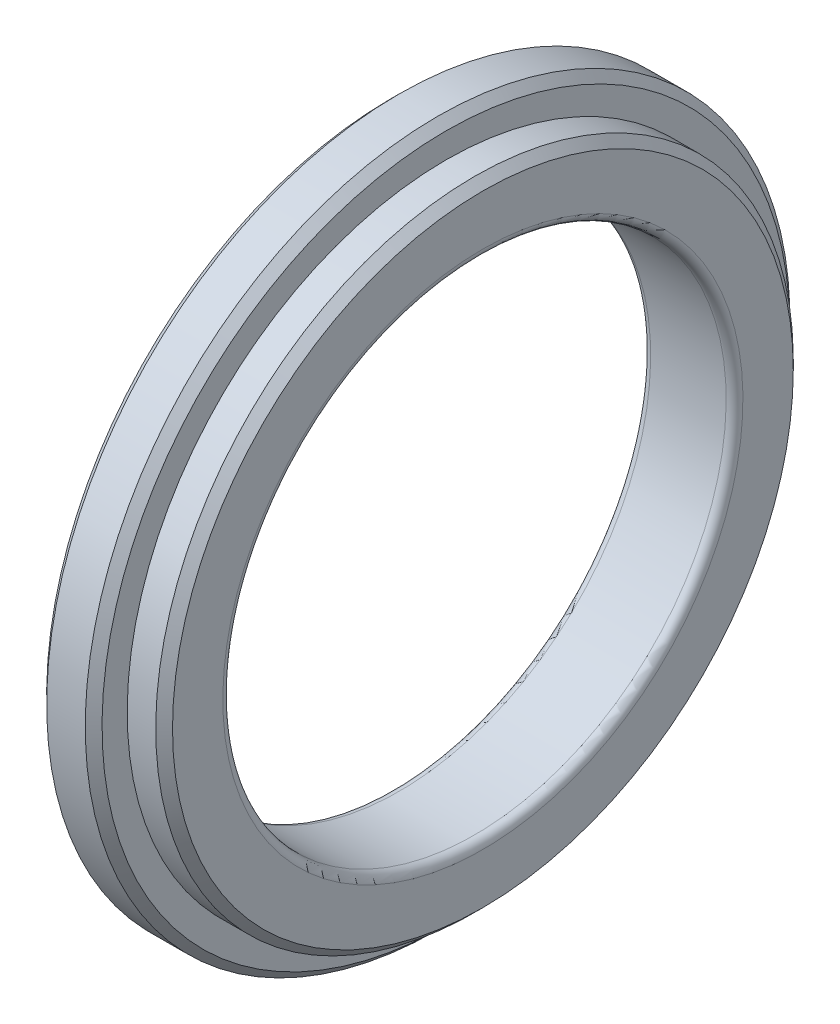
ISO-10303-21;
HEADER;
FILE_DESCRIPTION(('STEP AP214'),'2;1');
FILE_NAME('part.step','',(''),(''),'','','');
FILE_SCHEMA(('AUTOMOTIVE_DESIGN { 1 0 10303 214 1 1 1 1 }'));
ENDSEC;
DATA;
#1=APPLICATION_CONTEXT('core data for automotive mechanical design processes');
#2=APPLICATION_PROTOCOL_DEFINITION('international standard','automotive_design',2000,#1);
#3=PRODUCT_CONTEXT('',#1,'mechanical');
#4=PRODUCT('Part','Part','',(#3));
#5=PRODUCT_RELATED_PRODUCT_CATEGORY('part','',(#4));
#6=PRODUCT_DEFINITION_FORMATION('','',#4);
#7=PRODUCT_DEFINITION_CONTEXT('part definition',#1,'design');
#8=PRODUCT_DEFINITION('design','',#6,#7);
#9=PRODUCT_DEFINITION_SHAPE('','',#8);
#10=(LENGTH_UNIT() NAMED_UNIT(*) SI_UNIT(.MILLI.,.METRE.));
#11=(NAMED_UNIT(*) PLANE_ANGLE_UNIT() SI_UNIT($,.RADIAN.));
#12=(NAMED_UNIT(*) SI_UNIT($,.STERADIAN.) SOLID_ANGLE_UNIT());
#13=UNCERTAINTY_MEASURE_WITH_UNIT(LENGTH_MEASURE(1.E-05),#10,'distance_accuracy_value','');
#14=(GEOMETRIC_REPRESENTATION_CONTEXT(3) GLOBAL_UNCERTAINTY_ASSIGNED_CONTEXT((#13)) GLOBAL_UNIT_ASSIGNED_CONTEXT((#10,
#11,#12)) REPRESENTATION_CONTEXT('',''));
#15=CARTESIAN_POINT('',(0.,0.,0.));
#16=DIRECTION('',(0.,0.,1.));
#17=DIRECTION('',(1.,0.,0.));
#18=AXIS2_PLACEMENT_3D('',#15,#16,#17);
#19=CARTESIAN_POINT('',(28.25,0.,0.));
#20=DIRECTION('',(-1.,0.,0.));
#21=DIRECTION('',(0.,1.,0.));
#22=AXIS2_PLACEMENT_3D('',#19,#20,#21);
#23=CONICAL_SURFACE('',#22,18.75,0.785398163397448);
#24=CARTESIAN_POINT('',(28.,0.,0.));
#25=DIRECTION('',(1.,0.,0.));
#26=DIRECTION('',(0.,1.,0.));
#27=AXIS2_PLACEMENT_3D('',#24,#25,#26);
#28=CIRCLE('',#27,19.);
#29=CARTESIAN_POINT('',(28.,19.,0.));
#30=VERTEX_POINT('',#29);
#31=EDGE_CURVE('E11',#30,#30,#28,.T.);
#32=ORIENTED_EDGE('',*,*,#31,.T.);
#33=EDGE_LOOP('',(#32));
#34=FACE_BOUND('',#33,.T.);
#35=CARTESIAN_POINT('',(28.5,0.,0.));
#36=DIRECTION('',(1.,0.,0.));
#37=DIRECTION('',(0.,1.,0.));
#38=AXIS2_PLACEMENT_3D('',#35,#36,#37);
#39=CIRCLE('',#38,18.5);
#40=CARTESIAN_POINT('',(28.5,18.5,0.));
#41=VERTEX_POINT('',#40);
#42=EDGE_CURVE('E44',#41,#41,#39,.T.);
#43=ORIENTED_EDGE('',*,*,#42,.F.);
#44=EDGE_LOOP('',(#43));
#45=FACE_BOUND('',#44,.T.);
#46=ADVANCED_FACE('F17',(#34,#45),#23,.T.);
#47=CARTESIAN_POINT('',(27.15,0.,0.));
#48=DIRECTION('',(-1.,0.,0.));
#49=DIRECTION('',(0.,1.,0.));
#50=AXIS2_PLACEMENT_3D('',#47,#48,#49);
#51=CYLINDRICAL_SURFACE('',#50,19.);
#52=CARTESIAN_POINT('',(26.3,0.,0.));
#53=DIRECTION('',(1.,0.,0.));
#54=DIRECTION('',(0.,1.,0.));
#55=AXIS2_PLACEMENT_3D('',#52,#53,#54);
#56=CIRCLE('',#55,19.);
#57=CARTESIAN_POINT('',(26.3,19.,0.));
#58=VERTEX_POINT('',#57);
#59=EDGE_CURVE('E26',#58,#58,#56,.T.);
#60=ORIENTED_EDGE('',*,*,#59,.T.);
#61=EDGE_LOOP('',(#60));
#62=FACE_BOUND('',#61,.T.);
#63=ORIENTED_EDGE('',*,*,#31,.F.);
#64=EDGE_LOOP('',(#63));
#65=FACE_BOUND('',#64,.T.);
#66=ADVANCED_FACE('F106',(#62,#65),#51,.T.);
#67=CARTESIAN_POINT('',(26.3,19.75,0.));
#68=DIRECTION('',(1.,0.,0.));
#69=DIRECTION('',(0.,1.,0.));
#70=AXIS2_PLACEMENT_3D('',#67,#68,#69);
#71=PLANE('',#70);
#72=CARTESIAN_POINT('',(26.3,0.,0.));
#73=DIRECTION('',(1.,0.,0.));
#74=DIRECTION('',(0.,1.,0.));
#75=AXIS2_PLACEMENT_3D('',#72,#73,#74);
#76=CIRCLE('',#75,20.5);
#77=CARTESIAN_POINT('',(26.3,20.5,0.));
#78=VERTEX_POINT('',#77);
#79=EDGE_CURVE('E82',#78,#78,#76,.T.);
#80=ORIENTED_EDGE('',*,*,#79,.T.);
#81=EDGE_LOOP('',(#80));
#82=FACE_BOUND('',#81,.T.);
#83=ORIENTED_EDGE('',*,*,#59,.F.);
#84=EDGE_LOOP('',(#83));
#85=FACE_BOUND('',#84,.T.);
#86=ADVANCED_FACE('F102',(#82,#85),#71,.T.);
#87=CARTESIAN_POINT('',(26.05,0.,0.));
#88=DIRECTION('',(-1.,0.,0.));
#89=DIRECTION('',(0.,1.,0.));
#90=AXIS2_PLACEMENT_3D('',#87,#88,#89);
#91=CONICAL_SURFACE('',#90,20.75,0.785398163397448);
#92=CARTESIAN_POINT('',(25.8,0.,0.));
#93=DIRECTION('',(1.,0.,0.));
#94=DIRECTION('',(0.,1.,0.));
#95=AXIS2_PLACEMENT_3D('',#92,#93,#94);
#96=CIRCLE('',#95,21.);
#97=CARTESIAN_POINT('',(25.8,21.,0.));
#98=VERTEX_POINT('',#97);
#99=EDGE_CURVE('E20',#98,#98,#96,.T.);
#100=ORIENTED_EDGE('',*,*,#99,.T.);
#101=EDGE_LOOP('',(#100));
#102=FACE_BOUND('',#101,.T.);
#103=ORIENTED_EDGE('',*,*,#79,.F.);
#104=EDGE_LOOP('',(#103));
#105=FACE_BOUND('',#104,.T.);
#106=ADVANCED_FACE('F89',(#102,#105),#91,.T.);
#107=CARTESIAN_POINT('',(24.65,0.,0.));
#108=DIRECTION('',(-1.,0.,0.));
#109=DIRECTION('',(0.,1.,0.));
#110=AXIS2_PLACEMENT_3D('',#107,#108,#109);
#111=CYLINDRICAL_SURFACE('',#110,21.);
#112=CARTESIAN_POINT('',(23.5,0.,0.));
#113=DIRECTION('',(1.,0.,0.));
#114=DIRECTION('',(0.,1.,0.));
#115=AXIS2_PLACEMENT_3D('',#112,#113,#114);
#116=CIRCLE('',#115,21.);
#117=CARTESIAN_POINT('',(23.5,21.,0.));
#118=VERTEX_POINT('',#117);
#119=EDGE_CURVE('E64',#118,#118,#116,.T.);
#120=ORIENTED_EDGE('',*,*,#119,.T.);
#121=EDGE_LOOP('',(#120));
#122=FACE_BOUND('',#121,.T.);
#123=ORIENTED_EDGE('',*,*,#99,.F.);
#124=EDGE_LOOP('',(#123));
#125=FACE_BOUND('',#124,.T.);
#126=ADVANCED_FACE('F92',(#122,#125),#111,.T.);
#127=CARTESIAN_POINT('',(23.25,0.,0.));
#128=DIRECTION('',(1.,0.,0.));
#129=DIRECTION('',(0.,1.,0.));
#130=AXIS2_PLACEMENT_3D('',#127,#128,#129);
#131=CONICAL_SURFACE('',#130,20.75,0.785398163397448);
#132=CARTESIAN_POINT('',(23.,0.,0.));
#133=DIRECTION('',(1.,0.,0.));
#134=DIRECTION('',(0.,1.,0.));
#135=AXIS2_PLACEMENT_3D('',#132,#133,#134);
#136=CIRCLE('',#135,20.5);
#137=CARTESIAN_POINT('',(23.,20.5,0.));
#138=VERTEX_POINT('',#137);
#139=EDGE_CURVE('E68',#138,#138,#136,.T.);
#140=ORIENTED_EDGE('',*,*,#139,.T.);
#141=EDGE_LOOP('',(#140));
#142=FACE_BOUND('',#141,.T.);
#143=ORIENTED_EDGE('',*,*,#119,.F.);
#144=EDGE_LOOP('',(#143));
#145=FACE_BOUND('',#144,.T.);
#146=ADVANCED_FACE('F94',(#142,#145),#131,.T.);
#147=CARTESIAN_POINT('',(23.,18.,0.));
#148=DIRECTION('',(-1.,0.,0.));
#149=DIRECTION('',(0.,-1.,0.));
#150=AXIS2_PLACEMENT_3D('',#147,#148,#149);
#151=PLANE('',#150);
#152=CARTESIAN_POINT('',(23.,0.,0.));
#153=DIRECTION('',(1.,0.,0.));
#154=DIRECTION('',(0.,1.,0.));
#155=AXIS2_PLACEMENT_3D('',#152,#153,#154);
#156=CIRCLE('',#155,15.5);
#157=CARTESIAN_POINT('',(23.,15.5,0.));
#158=VERTEX_POINT('',#157);
#159=EDGE_CURVE('E72',#158,#158,#156,.T.);
#160=ORIENTED_EDGE('',*,*,#159,.T.);
#161=EDGE_LOOP('',(#160));
#162=FACE_BOUND('',#161,.T.);
#163=ORIENTED_EDGE('',*,*,#139,.F.);
#164=EDGE_LOOP('',(#163));
#165=FACE_BOUND('',#164,.T.);
#166=ADVANCED_FACE('F73',(#162,#165),#151,.T.);
#167=CARTESIAN_POINT('',(23.5,0.,0.));
#168=DIRECTION('',(1.,0.,0.));
#169=DIRECTION('',(0.,0.,-1.));
#170=AXIS2_PLACEMENT_3D('',#167,#168,#169);
#171=TOROIDAL_SURFACE('',#170,15.5,0.5);
#172=CARTESIAN_POINT('',(23.5,0.,0.));
#173=DIRECTION('',(1.,0.,0.));
#174=DIRECTION('',(0.,1.,0.));
#175=AXIS2_PLACEMENT_3D('',#172,#173,#174);
#176=CIRCLE('',#175,15.);
#177=CARTESIAN_POINT('',(23.5,15.,0.));
#178=VERTEX_POINT('',#177);
#179=EDGE_CURVE('E76',#178,#178,#176,.T.);
#180=ORIENTED_EDGE('',*,*,#179,.T.);
#181=EDGE_LOOP('',(#180));
#182=FACE_BOUND('',#181,.T.);
#183=ORIENTED_EDGE('',*,*,#159,.F.);
#184=EDGE_LOOP('',(#183));
#185=FACE_BOUND('',#184,.T.);
#186=ADVANCED_FACE('F124',(#182,#185),#171,.T.);
#187=CARTESIAN_POINT('',(25.75,0.,0.));
#188=DIRECTION('',(-1.,0.,0.));
#189=DIRECTION('',(0.,1.,0.));
#190=AXIS2_PLACEMENT_3D('',#187,#188,#189);
#191=CYLINDRICAL_SURFACE('',#190,15.);
#192=CARTESIAN_POINT('',(28.,0.,0.));
#193=DIRECTION('',(1.,0.,0.));
#194=DIRECTION('',(0.,1.,0.));
#195=AXIS2_PLACEMENT_3D('',#192,#193,#194);
#196=CIRCLE('',#195,15.);
#197=CARTESIAN_POINT('',(28.,15.,0.));
#198=VERTEX_POINT('',#197);
#199=EDGE_CURVE('E78',#198,#198,#196,.T.);
#200=ORIENTED_EDGE('',*,*,#199,.T.);
#201=EDGE_LOOP('',(#200));
#202=FACE_BOUND('',#201,.T.);
#203=ORIENTED_EDGE('',*,*,#179,.F.);
#204=EDGE_LOOP('',(#203));
#205=FACE_BOUND('',#204,.T.);
#206=ADVANCED_FACE('F125',(#202,#205),#191,.F.);
#207=CARTESIAN_POINT('',(28.,0.,0.));
#208=DIRECTION('',(1.,0.,0.));
#209=DIRECTION('',(0.,0.,-1.));
#210=AXIS2_PLACEMENT_3D('',#207,#208,#209);
#211=TOROIDAL_SURFACE('',#210,15.5,0.5);
#212=CARTESIAN_POINT('',(28.5,0.,0.));
#213=DIRECTION('',(1.,0.,0.));
#214=DIRECTION('',(0.,1.,0.));
#215=AXIS2_PLACEMENT_3D('',#212,#213,#214);
#216=CIRCLE('',#215,15.5);
#217=CARTESIAN_POINT('',(28.5,15.5,0.));
#218=VERTEX_POINT('',#217);
#219=EDGE_CURVE('E51',#218,#218,#216,.T.);
#220=ORIENTED_EDGE('',*,*,#219,.T.);
#221=EDGE_LOOP('',(#220));
#222=FACE_BOUND('',#221,.T.);
#223=ORIENTED_EDGE('',*,*,#199,.F.);
#224=EDGE_LOOP('',(#223));
#225=FACE_BOUND('',#224,.T.);
#226=ADVANCED_FACE('F121',(#222,#225),#211,.T.);
#227=CARTESIAN_POINT('',(28.5,17.,0.));
#228=DIRECTION('',(1.,0.,0.));
#229=DIRECTION('',(0.,1.,0.));
#230=AXIS2_PLACEMENT_3D('',#227,#228,#229);
#231=PLANE('',#230);
#232=ORIENTED_EDGE('',*,*,#42,.T.);
#233=EDGE_LOOP('',(#232));
#234=FACE_BOUND('',#233,.T.);
#235=ORIENTED_EDGE('',*,*,#219,.F.);
#236=EDGE_LOOP('',(#235));
#237=FACE_BOUND('',#236,.T.);
#238=ADVANCED_FACE('F128',(#234,#237),#231,.T.);
#239=CLOSED_SHELL('',(#46,#66,#86,#106,#126,#146,#166,#186,#206,#226,#238));
#240=MANIFOLD_SOLID_BREP('B1',#239);
#241=ADVANCED_BREP_SHAPE_REPRESENTATION('',(#18,#240),#14);
#242=SHAPE_DEFINITION_REPRESENTATION(#9,#241);
ENDSEC;
END-ISO-10303-21;
